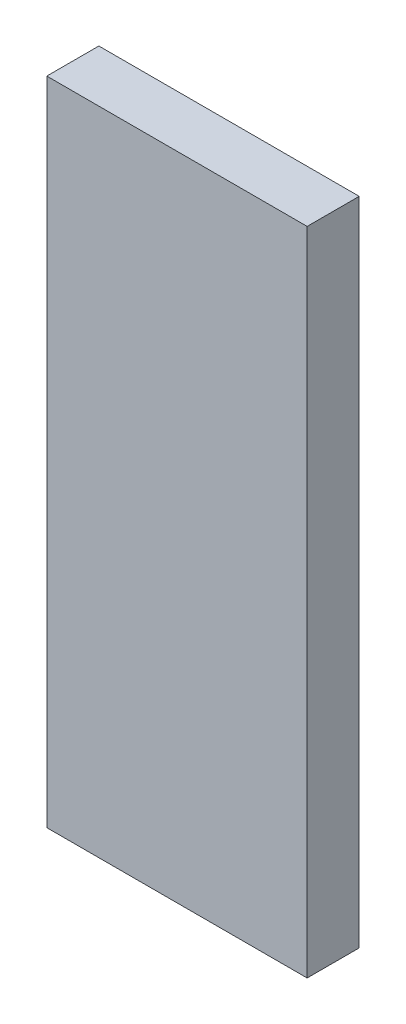
ISO-10303-21;
HEADER;
FILE_DESCRIPTION(('STEP AP214'),'2;1');
FILE_NAME('part.step','',(''),(''),'','','');
FILE_SCHEMA(('AUTOMOTIVE_DESIGN { 1 0 10303 214 1 1 1 1 }'));
ENDSEC;
DATA;
#1=APPLICATION_CONTEXT('core data for automotive mechanical design processes');
#2=APPLICATION_PROTOCOL_DEFINITION('international standard','automotive_design',2000,#1);
#3=PRODUCT_CONTEXT('',#1,'mechanical');
#4=PRODUCT('Part','Part','',(#3));
#5=PRODUCT_RELATED_PRODUCT_CATEGORY('part','',(#4));
#6=PRODUCT_DEFINITION_FORMATION('','',#4);
#7=PRODUCT_DEFINITION_CONTEXT('part definition',#1,'design');
#8=PRODUCT_DEFINITION('design','',#6,#7);
#9=PRODUCT_DEFINITION_SHAPE('','',#8);
#10=(LENGTH_UNIT() NAMED_UNIT(*) SI_UNIT(.MILLI.,.METRE.));
#11=(NAMED_UNIT(*) PLANE_ANGLE_UNIT() SI_UNIT($,.RADIAN.));
#12=(NAMED_UNIT(*) SI_UNIT($,.STERADIAN.) SOLID_ANGLE_UNIT());
#13=UNCERTAINTY_MEASURE_WITH_UNIT(LENGTH_MEASURE(1.E-05),#10,'distance_accuracy_value','');
#14=(GEOMETRIC_REPRESENTATION_CONTEXT(3) GLOBAL_UNCERTAINTY_ASSIGNED_CONTEXT((#13)) GLOBAL_UNIT_ASSIGNED_CONTEXT((#10,
#11,#12)) REPRESENTATION_CONTEXT('',''));
#15=CARTESIAN_POINT('',(0.,0.,0.));
#16=DIRECTION('',(0.,0.,1.));
#17=DIRECTION('',(1.,0.,0.));
#18=AXIS2_PLACEMENT_3D('',#15,#16,#17);
#19=CARTESIAN_POINT('',(20.,100.,-4.));
#20=DIRECTION('',(-1.,0.,0.));
#21=DIRECTION('',(0.,0.,1.));
#22=AXIS2_PLACEMENT_3D('',#19,#20,#21);
#23=PLANE('',#22);
#24=DIRECTION('',(0.,0.,-1.));
#25=VECTOR('',#24,1.);
#26=CARTESIAN_POINT('',(20.,0.,-4.));
#27=LINE('',#26,#25);
#28=CARTESIAN_POINT('',(20.,0.,4.));
#29=VERTEX_POINT('',#28);
#30=CARTESIAN_POINT('',(20.,0.,-4.));
#31=VERTEX_POINT('',#30);
#32=EDGE_CURVE('E108',#29,#31,#27,.T.);
#33=ORIENTED_EDGE('',*,*,#32,.T.);
#34=DIRECTION('',(0.,-1.,0.));
#35=VECTOR('',#34,1.);
#36=CARTESIAN_POINT('',(20.,100.,-4.));
#37=LINE('',#36,#35);
#38=CARTESIAN_POINT('',(20.,100.,-4.));
#39=VERTEX_POINT('',#38);
#40=EDGE_CURVE('E11',#39,#31,#37,.T.);
#41=ORIENTED_EDGE('',*,*,#40,.F.);
#42=DIRECTION('',(0.,0.,-1.));
#43=VECTOR('',#42,1.);
#44=CARTESIAN_POINT('',(20.,100.,-4.));
#45=LINE('',#44,#43);
#46=CARTESIAN_POINT('',(20.,100.,4.));
#47=VERTEX_POINT('',#46);
#48=EDGE_CURVE('E96',#47,#39,#45,.T.);
#49=ORIENTED_EDGE('',*,*,#48,.F.);
#50=DIRECTION('',(0.,-1.,0.));
#51=VECTOR('',#50,1.);
#52=CARTESIAN_POINT('',(20.,100.,4.));
#53=LINE('',#52,#51);
#54=EDGE_CURVE('E104',#47,#29,#53,.T.);
#55=ORIENTED_EDGE('',*,*,#54,.T.);
#56=EDGE_LOOP('',(#33,#41,#49,#55));
#57=FACE_BOUND('',#56,.T.);
#58=ADVANCED_FACE('F45',(#57),#23,.F.);
#59=CARTESIAN_POINT('',(-20.,100.,-4.));
#60=DIRECTION('',(0.,0.,1.));
#61=DIRECTION('',(1.,0.,0.));
#62=AXIS2_PLACEMENT_3D('',#59,#60,#61);
#63=PLANE('',#62);
#64=DIRECTION('',(-1.,0.,0.));
#65=VECTOR('',#64,1.);
#66=CARTESIAN_POINT('',(-20.,0.,-4.));
#67=LINE('',#66,#65);
#68=CARTESIAN_POINT('',(-20.,0.,-4.));
#69=VERTEX_POINT('',#68);
#70=EDGE_CURVE('E100',#31,#69,#67,.T.);
#71=ORIENTED_EDGE('',*,*,#70,.T.);
#72=DIRECTION('',(0.,-1.,0.));
#73=VECTOR('',#72,1.);
#74=CARTESIAN_POINT('',(-20.,100.,-4.));
#75=LINE('',#74,#73);
#76=CARTESIAN_POINT('',(-20.,100.,-4.));
#77=VERTEX_POINT('',#76);
#78=EDGE_CURVE('E53',#77,#69,#75,.T.);
#79=ORIENTED_EDGE('',*,*,#78,.F.);
#80=DIRECTION('',(-1.,0.,0.));
#81=VECTOR('',#80,1.);
#82=CARTESIAN_POINT('',(-20.,100.,-4.));
#83=LINE('',#82,#81);
#84=EDGE_CURVE('E91',#39,#77,#83,.T.);
#85=ORIENTED_EDGE('',*,*,#84,.F.);
#86=ORIENTED_EDGE('',*,*,#40,.T.);
#87=EDGE_LOOP('',(#71,#79,#85,#86));
#88=FACE_BOUND('',#87,.T.);
#89=ADVANCED_FACE('F99',(#88),#63,.F.);
#90=CARTESIAN_POINT('',(-20.,100.,-4.));
#91=DIRECTION('',(1.,0.,0.));
#92=DIRECTION('',(0.,0.,-1.));
#93=AXIS2_PLACEMENT_3D('',#90,#91,#92);
#94=PLANE('',#93);
#95=DIRECTION('',(0.,0.,1.));
#96=VECTOR('',#95,1.);
#97=CARTESIAN_POINT('',(-20.,0.,-4.));
#98=LINE('',#97,#96);
#99=CARTESIAN_POINT('',(-20.,0.,4.));
#100=VERTEX_POINT('',#99);
#101=EDGE_CURVE('E78',#69,#100,#98,.T.);
#102=ORIENTED_EDGE('',*,*,#101,.T.);
#103=DIRECTION('',(0.,-1.,0.));
#104=VECTOR('',#103,1.);
#105=CARTESIAN_POINT('',(-20.,100.,4.));
#106=LINE('',#105,#104);
#107=CARTESIAN_POINT('',(-20.,100.,4.));
#108=VERTEX_POINT('',#107);
#109=EDGE_CURVE('E101',#108,#100,#106,.T.);
#110=ORIENTED_EDGE('',*,*,#109,.F.);
#111=DIRECTION('',(0.,0.,1.));
#112=VECTOR('',#111,1.);
#113=CARTESIAN_POINT('',(-20.,100.,-4.));
#114=LINE('',#113,#112);
#115=EDGE_CURVE('E94',#77,#108,#114,.T.);
#116=ORIENTED_EDGE('',*,*,#115,.F.);
#117=ORIENTED_EDGE('',*,*,#78,.T.);
#118=EDGE_LOOP('',(#102,#110,#116,#117));
#119=FACE_BOUND('',#118,.T.);
#120=ADVANCED_FACE('F102',(#119),#94,.F.);
#121=CARTESIAN_POINT('',(-20.,100.,4.));
#122=DIRECTION('',(0.,0.,-1.));
#123=DIRECTION('',(-1.,0.,0.));
#124=AXIS2_PLACEMENT_3D('',#121,#122,#123);
#125=PLANE('',#124);
#126=DIRECTION('',(1.,0.,0.));
#127=VECTOR('',#126,1.);
#128=CARTESIAN_POINT('',(-20.,0.,4.));
#129=LINE('',#128,#127);
#130=EDGE_CURVE('E84',#100,#29,#129,.T.);
#131=ORIENTED_EDGE('',*,*,#130,.T.);
#132=ORIENTED_EDGE('',*,*,#54,.F.);
#133=DIRECTION('',(1.,0.,0.));
#134=VECTOR('',#133,1.);
#135=CARTESIAN_POINT('',(-20.,100.,4.));
#136=LINE('',#135,#134);
#137=EDGE_CURVE('E61',#108,#47,#136,.T.);
#138=ORIENTED_EDGE('',*,*,#137,.F.);
#139=ORIENTED_EDGE('',*,*,#109,.T.);
#140=EDGE_LOOP('',(#131,#132,#138,#139));
#141=FACE_BOUND('',#140,.T.);
#142=ADVANCED_FACE('F115',(#141),#125,.F.);
#143=CARTESIAN_POINT('',(0.,100.,0.));
#144=DIRECTION('',(0.,1.,0.));
#145=DIRECTION('',(0.,0.,1.));
#146=AXIS2_PLACEMENT_3D('',#143,#144,#145);
#147=PLANE('',#146);
#148=ORIENTED_EDGE('',*,*,#48,.T.);
#149=ORIENTED_EDGE('',*,*,#84,.T.);
#150=ORIENTED_EDGE('',*,*,#115,.T.);
#151=ORIENTED_EDGE('',*,*,#137,.T.);
#152=EDGE_LOOP('',(#148,#149,#150,#151));
#153=FACE_BOUND('',#152,.T.);
#154=ADVANCED_FACE('F92',(#153),#147,.T.);
#155=CARTESIAN_POINT('',(0.,0.,0.));
#156=DIRECTION('',(0.,1.,0.));
#157=DIRECTION('',(0.,0.,1.));
#158=AXIS2_PLACEMENT_3D('',#155,#156,#157);
#159=PLANE('',#158);
#160=ORIENTED_EDGE('',*,*,#32,.F.);
#161=ORIENTED_EDGE('',*,*,#130,.F.);
#162=ORIENTED_EDGE('',*,*,#101,.F.);
#163=ORIENTED_EDGE('',*,*,#70,.F.);
#164=EDGE_LOOP('',(#160,#161,#162,#163));
#165=FACE_BOUND('',#164,.T.);
#166=ADVANCED_FACE('F118',(#165),#159,.F.);
#167=CLOSED_SHELL('',(#58,#89,#120,#142,#154,#166));
#168=MANIFOLD_SOLID_BREP('B2',#167);
#169=ADVANCED_BREP_SHAPE_REPRESENTATION('',(#18,#168),#14);
#170=SHAPE_DEFINITION_REPRESENTATION(#9,#169);
ENDSEC;
END-ISO-10303-21;
